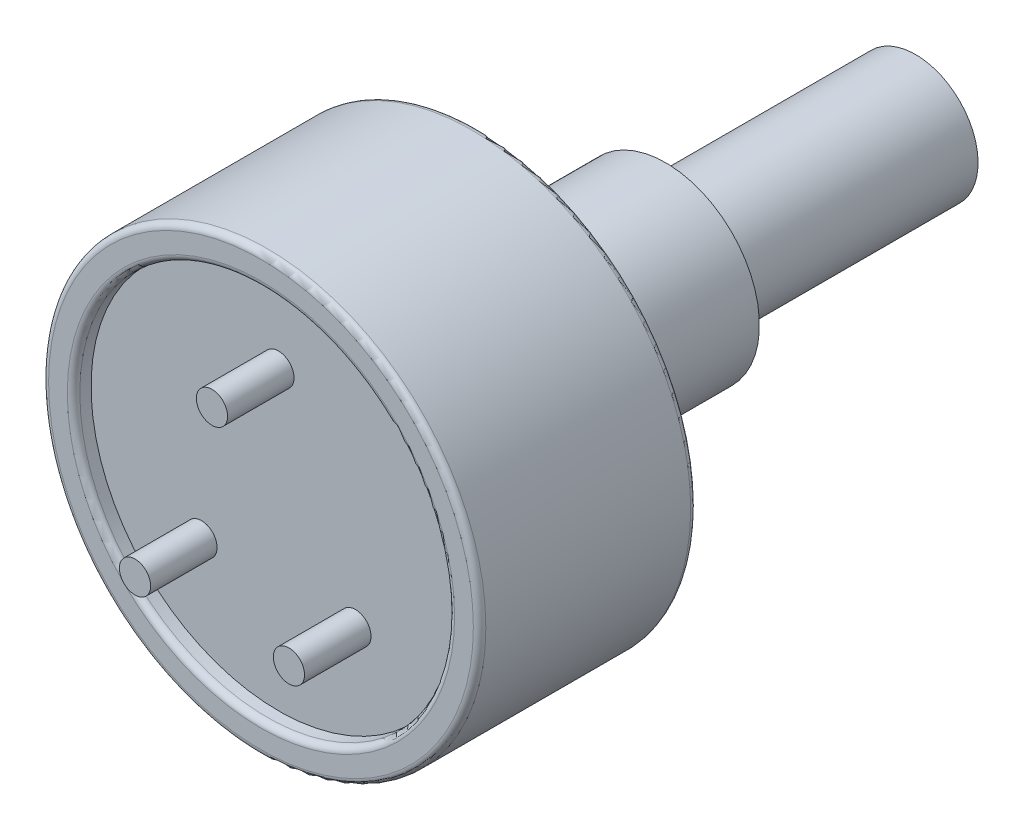
ISO-10303-21;
HEADER;
FILE_DESCRIPTION(('STEP AP214'),'2;1');
FILE_NAME('part.step','',(''),(''),'','','');
FILE_SCHEMA(('AUTOMOTIVE_DESIGN { 1 0 10303 214 1 1 1 1 }'));
ENDSEC;
DATA;
#1=APPLICATION_CONTEXT('core data for automotive mechanical design processes');
#2=APPLICATION_PROTOCOL_DEFINITION('international standard','automotive_design',2000,#1);
#3=PRODUCT_CONTEXT('',#1,'mechanical');
#4=PRODUCT('Part','Part','',(#3));
#5=PRODUCT_RELATED_PRODUCT_CATEGORY('part','',(#4));
#6=PRODUCT_DEFINITION_FORMATION('','',#4);
#7=PRODUCT_DEFINITION_CONTEXT('part definition',#1,'design');
#8=PRODUCT_DEFINITION('design','',#6,#7);
#9=PRODUCT_DEFINITION_SHAPE('','',#8);
#10=(LENGTH_UNIT() NAMED_UNIT(*) SI_UNIT(.MILLI.,.METRE.));
#11=(NAMED_UNIT(*) PLANE_ANGLE_UNIT() SI_UNIT($,.RADIAN.));
#12=(NAMED_UNIT(*) SI_UNIT($,.STERADIAN.) SOLID_ANGLE_UNIT());
#13=UNCERTAINTY_MEASURE_WITH_UNIT(LENGTH_MEASURE(1.E-05),#10,'distance_accuracy_value','');
#14=(GEOMETRIC_REPRESENTATION_CONTEXT(3) GLOBAL_UNCERTAINTY_ASSIGNED_CONTEXT((#13)) GLOBAL_UNIT_ASSIGNED_CONTEXT((#10,
#11,#12)) REPRESENTATION_CONTEXT('',''));
#15=CARTESIAN_POINT('',(0.,0.,0.));
#16=DIRECTION('',(0.,0.,1.));
#17=DIRECTION('',(1.,0.,0.));
#18=AXIS2_PLACEMENT_3D('',#15,#16,#17);
#19=CARTESIAN_POINT('',(0.,0.0193468685916,-22.225));
#20=DIRECTION('',(0.,0.,1.));
#21=DIRECTION('',(1.,0.,0.));
#22=AXIS2_PLACEMENT_3D('',#19,#20,#21);
#23=PLANE('',#22);
#24=CARTESIAN_POINT('',(0.,0.,-22.2249999996));
#25=DIRECTION('',(0.,0.,-1.));
#26=DIRECTION('',(-1.,0.,0.));
#27=AXIS2_PLACEMENT_3D('',#24,#25,#26);
#28=CIRCLE('',#27,3.175);
#29=CARTESIAN_POINT('',(2.17670738501993,-2.3114,-22.2249999996));
#30=VERTEX_POINT('',#29);
#31=CARTESIAN_POINT('',(-2.17670738506493,-2.3114,-22.2249999996));
#32=VERTEX_POINT('',#31);
#33=EDGE_CURVE('E63',#30,#32,#28,.F.);
#34=ORIENTED_EDGE('',*,*,#33,.F.);
#35=DIRECTION('',(1.,0.,0.));
#36=VECTOR('',#35,1.);
#37=CARTESIAN_POINT('',(2.17670738502,-2.3114,-22.2249999996));
#38=LINE('',#37,#36);
#39=EDGE_CURVE('E75',#32,#30,#38,.T.);
#40=ORIENTED_EDGE('',*,*,#39,.F.);
#41=EDGE_LOOP('',(#34,#40));
#42=FACE_BOUND('',#41,.T.);
#43=ADVANCED_FACE('F17',(#42),#23,.F.);
#44=CARTESIAN_POINT('',(-3.9116,-3.90121592455,13.5382));
#45=DIRECTION('',(0.,0.,1.));
#46=DIRECTION('',(1.,0.,0.));
#47=AXIS2_PLACEMENT_3D('',#44,#45,#46);
#48=PLANE('',#47);
#49=CARTESIAN_POINT('',(-3.9116,-3.90121592455,13.5382000003));
#50=DIRECTION('',(0.,0.,1.));
#51=DIRECTION('',(1.,0.,0.));
#52=AXIS2_PLACEMENT_3D('',#49,#50,#51);
#53=CIRCLE('',#52,0.79375);
#54=CARTESIAN_POINT('',(-3.11785,-3.90121592455,13.5382000003));
#55=VERTEX_POINT('',#54);
#56=EDGE_CURVE('E126',#55,#55,#53,.F.);
#57=ORIENTED_EDGE('',*,*,#56,.F.);
#58=EDGE_LOOP('',(#57));
#59=FACE_BOUND('',#58,.T.);
#60=ADVANCED_FACE('F436',(#59),#48,.T.);
#61=CARTESIAN_POINT('',(3.9116,-3.90121592455,13.5382));
#62=DIRECTION('',(0.,0.,1.));
#63=DIRECTION('',(1.,0.,0.));
#64=AXIS2_PLACEMENT_3D('',#61,#62,#63);
#65=PLANE('',#64);
#66=CARTESIAN_POINT('',(3.9116,-3.90121592455,13.5382000003));
#67=DIRECTION('',(0.,0.,1.));
#68=DIRECTION('',(1.,0.,0.));
#69=AXIS2_PLACEMENT_3D('',#66,#67,#68);
#70=CIRCLE('',#69,0.79375);
#71=CARTESIAN_POINT('',(4.70535,-3.90121592455,13.5382000003));
#72=VERTEX_POINT('',#71);
#73=EDGE_CURVE('E123',#72,#72,#70,.F.);
#74=ORIENTED_EDGE('',*,*,#73,.F.);
#75=EDGE_LOOP('',(#74));
#76=FACE_BOUND('',#75,.T.);
#77=ADVANCED_FACE('F426',(#76),#65,.T.);
#78=CARTESIAN_POINT('',(0.,5.5245,13.5382));
#79=DIRECTION('',(0.,0.,1.));
#80=DIRECTION('',(1.,0.,0.));
#81=AXIS2_PLACEMENT_3D('',#78,#79,#80);
#82=PLANE('',#81);
#83=CARTESIAN_POINT('',(0.,5.5245,13.5382000003));
#84=DIRECTION('',(0.,0.,1.));
#85=DIRECTION('',(1.,0.,0.));
#86=AXIS2_PLACEMENT_3D('',#83,#84,#85);
#87=CIRCLE('',#86,0.79375);
#88=CARTESIAN_POINT('',(0.79375,5.5245,13.5382000003));
#89=VERTEX_POINT('',#88);
#90=EDGE_CURVE('E120',#89,#89,#87,.F.);
#91=ORIENTED_EDGE('',*,*,#90,.F.);
#92=EDGE_LOOP('',(#91));
#93=FACE_BOUND('',#92,.T.);
#94=ADVANCED_FACE('F417',(#93),#82,.T.);
#95=CARTESIAN_POINT('',(0.,0.,0.));
#96=DIRECTION('',(0.,0.,-1.));
#97=DIRECTION('',(-1.,0.,0.));
#98=AXIS2_PLACEMENT_3D('',#95,#96,#97);
#99=CYLINDRICAL_SURFACE('',#98,3.175);
#100=DIRECTION('',(0.,0.,-1.));
#101=VECTOR('',#100,1.);
#102=CARTESIAN_POINT('',(2.17670738502,-2.3114,0.));
#103=LINE('',#102,#101);
#104=CARTESIAN_POINT('',(2.17670738501462,-2.3114000000075,-9.525000000185));
#105=VERTEX_POINT('',#104);
#106=EDGE_CURVE('E72',#30,#105,#103,.F.);
#107=ORIENTED_EDGE('',*,*,#106,.F.);
#108=ORIENTED_EDGE('',*,*,#33,.T.);
#109=DIRECTION('',(0.,0.,-1.));
#110=VECTOR('',#109,1.);
#111=CARTESIAN_POINT('',(-2.17670738511,-2.3114,0.));
#112=LINE('',#111,#110);
#113=CARTESIAN_POINT('',(-2.17670738505962,-2.311400000005,-9.525));
#114=VERTEX_POINT('',#113);
#115=EDGE_CURVE('E69',#114,#32,#112,.T.);
#116=ORIENTED_EDGE('',*,*,#115,.F.);
#117=CARTESIAN_POINT('',(0.,0.,-9.52500000037));
#118=DIRECTION('',(0.,0.,-1.));
#119=DIRECTION('',(-1.,0.,0.));
#120=AXIS2_PLACEMENT_3D('',#117,#118,#119);
#121=CIRCLE('',#120,3.175);
#122=EDGE_CURVE('E118',#114,#105,#121,.T.);
#123=ORIENTED_EDGE('',*,*,#122,.T.);
#124=EDGE_LOOP('',(#107,#108,#116,#123));
#125=FACE_BOUND('',#124,.T.);
#126=ADVANCED_FACE('F67',(#125),#99,.T.);
#127=CARTESIAN_POINT('',(2.17670738502,-2.3114,0.));
#128=DIRECTION('',(0.,-1.,0.));
#129=DIRECTION('',(0.,0.,-1.));
#130=AXIS2_PLACEMENT_3D('',#127,#128,#129);
#131=PLANE('',#130);
#132=ORIENTED_EDGE('',*,*,#39,.T.);
#133=ORIENTED_EDGE('',*,*,#106,.T.);
#134=DIRECTION('',(1.,0.,0.));
#135=VECTOR('',#134,1.);
#136=CARTESIAN_POINT('',(0.,-2.31140000001,-9.525));
#137=LINE('',#136,#135);
#138=EDGE_CURVE('E80',#105,#114,#137,.F.);
#139=ORIENTED_EDGE('',*,*,#138,.T.);
#140=ORIENTED_EDGE('',*,*,#115,.T.);
#141=EDGE_LOOP('',(#132,#133,#139,#140));
#142=FACE_BOUND('',#141,.T.);
#143=ADVANCED_FACE('F78',(#142),#131,.T.);
#144=CARTESIAN_POINT('',(-3.9116,-3.90121592455,0.));
#145=DIRECTION('',(0.,0.,1.));
#146=DIRECTION('',(1.,0.,0.));
#147=AXIS2_PLACEMENT_3D('',#144,#145,#146);
#148=CYLINDRICAL_SURFACE('',#147,0.79375);
#149=CARTESIAN_POINT('',(-3.9116,-3.90121592455,10.1600000001));
#150=DIRECTION('',(0.,0.,1.));
#151=DIRECTION('',(1.,0.,0.));
#152=AXIS2_PLACEMENT_3D('',#149,#150,#151);
#153=CIRCLE('',#152,0.79375);
#154=CARTESIAN_POINT('',(-3.11785,-3.90121592455,10.1600000001));
#155=VERTEX_POINT('',#154);
#156=EDGE_CURVE('E115',#155,#155,#153,.F.);
#157=ORIENTED_EDGE('',*,*,#156,.F.);
#158=EDGE_LOOP('',(#157));
#159=FACE_BOUND('',#158,.T.);
#160=ORIENTED_EDGE('',*,*,#56,.T.);
#161=EDGE_LOOP('',(#160));
#162=FACE_BOUND('',#161,.T.);
#163=ADVANCED_FACE('F390',(#159,#162),#148,.T.);
#164=CARTESIAN_POINT('',(3.9116,-3.90121592455,0.));
#165=DIRECTION('',(0.,0.,1.));
#166=DIRECTION('',(1.,0.,0.));
#167=AXIS2_PLACEMENT_3D('',#164,#165,#166);
#168=CYLINDRICAL_SURFACE('',#167,0.79375);
#169=CARTESIAN_POINT('',(3.9116,-3.90121592455,10.1600000001));
#170=DIRECTION('',(0.,0.,1.));
#171=DIRECTION('',(1.,0.,0.));
#172=AXIS2_PLACEMENT_3D('',#169,#170,#171);
#173=CIRCLE('',#172,0.79375);
#174=CARTESIAN_POINT('',(4.70535,-3.90121592455,10.1600000001));
#175=VERTEX_POINT('',#174);
#176=EDGE_CURVE('E112',#175,#175,#173,.F.);
#177=ORIENTED_EDGE('',*,*,#176,.F.);
#178=EDGE_LOOP('',(#177));
#179=FACE_BOUND('',#178,.T.);
#180=ORIENTED_EDGE('',*,*,#73,.T.);
#181=EDGE_LOOP('',(#180));
#182=FACE_BOUND('',#181,.T.);
#183=ADVANCED_FACE('F380',(#179,#182),#168,.T.);
#184=CARTESIAN_POINT('',(0.,5.5245,0.));
#185=DIRECTION('',(0.,0.,1.));
#186=DIRECTION('',(1.,0.,0.));
#187=AXIS2_PLACEMENT_3D('',#184,#185,#186);
#188=CYLINDRICAL_SURFACE('',#187,0.79375);
#189=CARTESIAN_POINT('',(0.,5.5245,10.1600000001));
#190=DIRECTION('',(0.,0.,1.));
#191=DIRECTION('',(1.,0.,0.));
#192=AXIS2_PLACEMENT_3D('',#189,#190,#191);
#193=CIRCLE('',#192,0.79375);
#194=CARTESIAN_POINT('',(0.79375,5.5245,10.1600000001));
#195=VERTEX_POINT('',#194);
#196=EDGE_CURVE('E109',#195,#195,#193,.F.);
#197=ORIENTED_EDGE('',*,*,#196,.F.);
#198=EDGE_LOOP('',(#197));
#199=FACE_BOUND('',#198,.T.);
#200=ORIENTED_EDGE('',*,*,#90,.T.);
#201=EDGE_LOOP('',(#200));
#202=FACE_BOUND('',#201,.T.);
#203=ADVANCED_FACE('F289',(#199,#202),#188,.T.);
#204=CARTESIAN_POINT('',(0.,0.,-9.525));
#205=DIRECTION('',(0.,0.,1.));
#206=DIRECTION('',(1.,0.,0.));
#207=AXIS2_PLACEMENT_3D('',#204,#205,#206);
#208=PLANE('',#207);
#209=ORIENTED_EDGE('',*,*,#122,.F.);
#210=ORIENTED_EDGE('',*,*,#138,.F.);
#211=EDGE_LOOP('',(#209,#210));
#212=FACE_BOUND('',#211,.T.);
#213=CARTESIAN_POINT('',(0.,0.,-9.52500000037));
#214=DIRECTION('',(0.,0.,-1.));
#215=DIRECTION('',(-1.,0.,0.));
#216=AXIS2_PLACEMENT_3D('',#213,#214,#215);
#217=CIRCLE('',#216,4.7625);
#218=CARTESIAN_POINT('',(-4.7625,0.,-9.52500000037));
#219=VERTEX_POINT('',#218);
#220=EDGE_CURVE('E106',#219,#219,#217,.F.);
#221=ORIENTED_EDGE('',*,*,#220,.F.);
#222=EDGE_LOOP('',(#221));
#223=FACE_BOUND('',#222,.T.);
#224=ADVANCED_FACE('F279',(#212,#223),#208,.F.);
#225=CARTESIAN_POINT('',(0.,0.,10.16));
#226=DIRECTION('',(0.,0.,1.));
#227=DIRECTION('',(1.,0.,0.));
#228=AXIS2_PLACEMENT_3D('',#225,#226,#227);
#229=PLANE('',#228);
#230=ORIENTED_EDGE('',*,*,#196,.T.);
#231=EDGE_LOOP('',(#230));
#232=FACE_BOUND('',#231,.T.);
#233=ORIENTED_EDGE('',*,*,#176,.T.);
#234=EDGE_LOOP('',(#233));
#235=FACE_BOUND('',#234,.T.);
#236=ORIENTED_EDGE('',*,*,#156,.T.);
#237=EDGE_LOOP('',(#236));
#238=FACE_BOUND('',#237,.T.);
#239=CARTESIAN_POINT('',(0.,0.,10.1600000001));
#240=DIRECTION('',(0.,0.,1.));
#241=DIRECTION('',(1.,0.,0.));
#242=AXIS2_PLACEMENT_3D('',#239,#240,#241);
#243=CIRCLE('',#242,9.525);
#244=CARTESIAN_POINT('',(9.525,0.,10.1600000001));
#245=VERTEX_POINT('',#244);
#246=EDGE_CURVE('E103',#245,#245,#243,.T.);
#247=ORIENTED_EDGE('',*,*,#246,.T.);
#248=EDGE_LOOP('',(#247));
#249=FACE_BOUND('',#248,.T.);
#250=ADVANCED_FACE('F277',(#232,#235,#238,#249),#229,.T.);
#251=CARTESIAN_POINT('',(0.,0.,0.));
#252=DIRECTION('',(0.,0.,-1.));
#253=DIRECTION('',(-1.,0.,0.));
#254=AXIS2_PLACEMENT_3D('',#251,#252,#253);
#255=CYLINDRICAL_SURFACE('',#254,4.7625);
#256=ORIENTED_EDGE('',*,*,#220,.T.);
#257=EDGE_LOOP('',(#256));
#258=FACE_BOUND('',#257,.T.);
#259=CARTESIAN_POINT('',(0.,0.,-1.49860000052));
#260=DIRECTION('',(0.,0.,-1.));
#261=DIRECTION('',(-1.,0.,0.));
#262=AXIS2_PLACEMENT_3D('',#259,#260,#261);
#263=CIRCLE('',#262,4.7625);
#264=CARTESIAN_POINT('',(-4.7625,0.,-1.49860000052));
#265=VERTEX_POINT('',#264);
#266=EDGE_CURVE('E100',#265,#265,#263,.T.);
#267=ORIENTED_EDGE('',*,*,#266,.T.);
#268=EDGE_LOOP('',(#267));
#269=FACE_BOUND('',#268,.T.);
#270=ADVANCED_FACE('F273',(#258,#269),#255,.T.);
#271=CARTESIAN_POINT('',(0.,0.,0.));
#272=DIRECTION('',(0.,0.,1.));
#273=DIRECTION('',(1.,0.,0.));
#274=AXIS2_PLACEMENT_3D('',#271,#272,#273);
#275=CYLINDRICAL_SURFACE('',#274,9.525);
#276=CARTESIAN_POINT('',(0.,0.,10.7315));
#277=DIRECTION('',(0.,0.,-1.));
#278=DIRECTION('',(-1.,0.,0.));
#279=AXIS2_PLACEMENT_3D('',#276,#277,#278);
#280=CIRCLE('',#279,9.525);
#281=CARTESIAN_POINT('',(-9.525,0.,10.7315));
#282=VERTEX_POINT('',#281);
#283=EDGE_CURVE('E99',#282,#282,#280,.T.);
#284=ORIENTED_EDGE('',*,*,#283,.F.);
#285=EDGE_LOOP('',(#284));
#286=FACE_BOUND('',#285,.T.);
#287=ORIENTED_EDGE('',*,*,#246,.F.);
#288=EDGE_LOOP('',(#287));
#289=FACE_BOUND('',#288,.T.);
#290=ADVANCED_FACE('F269',(#286,#289),#275,.F.);
#291=CARTESIAN_POINT('',(0.,7.366,-1.4986));
#292=DIRECTION('',(0.,0.,1.));
#293=DIRECTION('',(1.,0.,0.));
#294=AXIS2_PLACEMENT_3D('',#291,#292,#293);
#295=PLANE('',#294);
#296=CARTESIAN_POINT('',(0.,7.366,-1.4986));
#297=DIRECTION('',(0.,0.,-1.));
#298=DIRECTION('',(-1.,0.,0.));
#299=AXIS2_PLACEMENT_3D('',#296,#297,#298);
#300=CIRCLE('',#299,0.79375);
#301=CARTESIAN_POINT('',(-0.79375,7.366,-1.4986));
#302=VERTEX_POINT('',#301);
#303=EDGE_CURVE('E96',#302,#302,#300,.F.);
#304=ORIENTED_EDGE('',*,*,#303,.F.);
#305=EDGE_LOOP('',(#304));
#306=FACE_BOUND('',#305,.T.);
#307=ADVANCED_FACE('F272',(#306),#295,.F.);
#308=CARTESIAN_POINT('',(0.,0.,-1.4986));
#309=DIRECTION('',(0.,0.,1.));
#310=DIRECTION('',(1.,0.,0.));
#311=AXIS2_PLACEMENT_3D('',#308,#309,#310);
#312=PLANE('',#311);
#313=ORIENTED_EDGE('',*,*,#266,.F.);
#314=EDGE_LOOP('',(#313));
#315=FACE_BOUND('',#314,.T.);
#316=CARTESIAN_POINT('',(0.,0.,-1.49860000052));
#317=DIRECTION('',(0.,0.,-1.));
#318=DIRECTION('',(-1.,0.,0.));
#319=AXIS2_PLACEMENT_3D('',#316,#317,#318);
#320=CIRCLE('',#319,5.1562);
#321=CARTESIAN_POINT('',(-5.1562,0.,-1.49860000052));
#322=VERTEX_POINT('',#321);
#323=EDGE_CURVE('E92',#322,#322,#320,.F.);
#324=ORIENTED_EDGE('',*,*,#323,.F.);
#325=EDGE_LOOP('',(#324));
#326=FACE_BOUND('',#325,.T.);
#327=ADVANCED_FACE('F253',(#315,#326),#312,.F.);
#328=CARTESIAN_POINT('',(0.,0.,10.7315));
#329=DIRECTION('',(0.,0.,-1.));
#330=DIRECTION('',(-1.,0.,0.));
#331=AXIS2_PLACEMENT_3D('',#328,#329,#330);
#332=TOROIDAL_SURFACE('',#331,9.8425,0.3175);
#333=CARTESIAN_POINT('',(0.,0.,11.049));
#334=DIRECTION('',(0.,0.,1.));
#335=DIRECTION('',(-1.,0.,0.));
#336=AXIS2_PLACEMENT_3D('',#333,#334,#335);
#337=CIRCLE('',#336,9.84249999933);
#338=CARTESIAN_POINT('',(9.842499999531,0.,11.049));
#339=VERTEX_POINT('',#338);
#340=CARTESIAN_POINT('',(-9.842499999531,0.,11.049));
#341=VERTEX_POINT('',#340);
#342=EDGE_CURVE('E95',#339,#341,#337,.F.);
#343=ORIENTED_EDGE('',*,*,#342,.F.);
#344=CARTESIAN_POINT('',(0.,0.,11.049));
#345=DIRECTION('',(0.,0.,1.));
#346=DIRECTION('',(1.,0.,0.));
#347=AXIS2_PLACEMENT_3D('',#344,#345,#346);
#348=CIRCLE('',#347,9.842499999665);
#349=EDGE_CURVE('E228',#341,#339,#348,.F.);
#350=ORIENTED_EDGE('',*,*,#349,.F.);
#351=EDGE_LOOP('',(#343,#350));
#352=FACE_BOUND('',#351,.T.);
#353=ORIENTED_EDGE('',*,*,#283,.T.);
#354=EDGE_LOOP('',(#353));
#355=FACE_BOUND('',#354,.T.);
#356=ADVANCED_FACE('F248',(#352,#355),#332,.T.);
#357=CARTESIAN_POINT('',(0.,7.366,0.));
#358=DIRECTION('',(0.,0.,-1.));
#359=DIRECTION('',(-1.,0.,0.));
#360=AXIS2_PLACEMENT_3D('',#357,#358,#359);
#361=CYLINDRICAL_SURFACE('',#360,0.79375);
#362=ORIENTED_EDGE('',*,*,#303,.T.);
#363=EDGE_LOOP('',(#362));
#364=FACE_BOUND('',#363,.T.);
#365=CARTESIAN_POINT('',(0.,7.366,0.));
#366=DIRECTION('',(0.,0.,-1.));
#367=DIRECTION('',(-1.,0.,0.));
#368=AXIS2_PLACEMENT_3D('',#365,#366,#367);
#369=CIRCLE('',#368,0.79375);
#370=CARTESIAN_POINT('',(-0.79375,7.366,0.));
#371=VERTEX_POINT('',#370);
#372=EDGE_CURVE('E89',#371,#371,#369,.T.);
#373=ORIENTED_EDGE('',*,*,#372,.T.);
#374=EDGE_LOOP('',(#373));
#375=FACE_BOUND('',#374,.T.);
#376=ADVANCED_FACE('F252',(#364,#375),#361,.T.);
#377=CARTESIAN_POINT('',(0.,0.,0.));
#378=DIRECTION('',(0.,0.,-1.));
#379=DIRECTION('',(-1.,0.,0.));
#380=AXIS2_PLACEMENT_3D('',#377,#378,#379);
#381=CYLINDRICAL_SURFACE('',#380,5.1562);
#382=CARTESIAN_POINT('',(0.,0.,0.));
#383=DIRECTION('',(0.,0.,-1.));
#384=DIRECTION('',(-1.,0.,0.));
#385=AXIS2_PLACEMENT_3D('',#382,#383,#384);
#386=CIRCLE('',#385,5.1562);
#387=CARTESIAN_POINT('',(-5.1562,0.,0.));
#388=VERTEX_POINT('',#387);
#389=EDGE_CURVE('E85',#388,#388,#386,.T.);
#390=ORIENTED_EDGE('',*,*,#389,.T.);
#391=EDGE_LOOP('',(#390));
#392=FACE_BOUND('',#391,.T.);
#393=ORIENTED_EDGE('',*,*,#323,.T.);
#394=EDGE_LOOP('',(#393));
#395=FACE_BOUND('',#394,.T.);
#396=ADVANCED_FACE('F207',(#392,#395),#381,.T.);
#397=CARTESIAN_POINT('',(0.,0.,11.049));
#398=DIRECTION('',(0.,0.,1.));
#399=DIRECTION('',(1.,0.,0.));
#400=AXIS2_PLACEMENT_3D('',#397,#398,#399);
#401=PLANE('',#400);
#402=ORIENTED_EDGE('',*,*,#342,.T.);
#403=ORIENTED_EDGE('',*,*,#349,.T.);
#404=EDGE_LOOP('',(#402,#403));
#405=FACE_BOUND('',#404,.T.);
#406=CARTESIAN_POINT('',(0.,0.,11.049));
#407=DIRECTION('',(0.,0.,-1.));
#408=DIRECTION('',(-1.,0.,0.));
#409=AXIS2_PLACEMENT_3D('',#406,#407,#408);
#410=CIRCLE('',#409,10.795);
#411=CARTESIAN_POINT('',(-10.795,0.,11.049));
#412=VERTEX_POINT('',#411);
#413=CARTESIAN_POINT('',(10.795,0.,11.049));
#414=VERTEX_POINT('',#413);
#415=EDGE_CURVE('E132',#412,#414,#410,.T.);
#416=ORIENTED_EDGE('',*,*,#415,.F.);
#417=CARTESIAN_POINT('',(0.,0.,11.049));
#418=DIRECTION('',(0.,0.,-1.));
#419=DIRECTION('',(1.,0.,0.));
#420=AXIS2_PLACEMENT_3D('',#417,#418,#419);
#421=CIRCLE('',#420,10.795);
#422=EDGE_CURVE('E88',#414,#412,#421,.T.);
#423=ORIENTED_EDGE('',*,*,#422,.F.);
#424=EDGE_LOOP('',(#416,#423));
#425=FACE_BOUND('',#424,.T.);
#426=ADVANCED_FACE('F198',(#405,#425),#401,.T.);
#427=CARTESIAN_POINT('',(0.,0.,0.));
#428=DIRECTION('',(0.,0.,1.));
#429=DIRECTION('',(1.,0.,0.));
#430=AXIS2_PLACEMENT_3D('',#427,#428,#429);
#431=PLANE('',#430);
#432=ORIENTED_EDGE('',*,*,#389,.F.);
#433=EDGE_LOOP('',(#432));
#434=FACE_BOUND('',#433,.T.);
#435=ORIENTED_EDGE('',*,*,#372,.F.);
#436=EDGE_LOOP('',(#435));
#437=FACE_BOUND('',#436,.T.);
#438=CARTESIAN_POINT('',(0.,0.,0.));
#439=DIRECTION('',(0.,0.,1.));
#440=DIRECTION('',(1.,0.,0.));
#441=AXIS2_PLACEMENT_3D('',#438,#439,#440);
#442=CIRCLE('',#441,10.795);
#443=CARTESIAN_POINT('',(10.795,0.,0.));
#444=VERTEX_POINT('',#443);
#445=CARTESIAN_POINT('',(-10.795,0.,0.));
#446=VERTEX_POINT('',#445);
#447=EDGE_CURVE('E36',#444,#446,#442,.T.);
#448=ORIENTED_EDGE('',*,*,#447,.F.);
#449=CARTESIAN_POINT('',(0.,0.,0.));
#450=DIRECTION('',(0.,0.,1.));
#451=DIRECTION('',(-1.,0.,0.));
#452=AXIS2_PLACEMENT_3D('',#449,#450,#451);
#453=CIRCLE('',#452,10.795);
#454=EDGE_CURVE('E171',#446,#444,#453,.T.);
#455=ORIENTED_EDGE('',*,*,#454,.F.);
#456=EDGE_LOOP('',(#448,#455));
#457=FACE_BOUND('',#456,.T.);
#458=ADVANCED_FACE('F151',(#434,#437,#457),#431,.F.);
#459=CARTESIAN_POINT('',(0.,0.,10.7315));
#460=DIRECTION('',(0.,0.,1.));
#461=DIRECTION('',(-1.,0.,0.));
#462=AXIS2_PLACEMENT_3D('',#459,#460,#461);
#463=TOROIDAL_SURFACE('',#462,10.795,0.3175);
#464=ORIENTED_EDGE('',*,*,#415,.T.);
#465=ORIENTED_EDGE('',*,*,#422,.T.);
#466=EDGE_LOOP('',(#464,#465));
#467=FACE_BOUND('',#466,.T.);
#468=CARTESIAN_POINT('',(0.,0.,10.7315));
#469=DIRECTION('',(0.,0.,1.));
#470=DIRECTION('',(1.,0.,0.));
#471=AXIS2_PLACEMENT_3D('',#468,#469,#470);
#472=CIRCLE('',#471,11.1125);
#473=CARTESIAN_POINT('',(11.1125,0.,10.7315));
#474=VERTEX_POINT('',#473);
#475=EDGE_CURVE('E28',#474,#474,#472,.F.);
#476=ORIENTED_EDGE('',*,*,#475,.F.);
#477=EDGE_LOOP('',(#476));
#478=FACE_BOUND('',#477,.T.);
#479=ADVANCED_FACE('F139',(#467,#478),#463,.T.);
#480=CARTESIAN_POINT('',(0.,0.,0.3175));
#481=DIRECTION('',(0.,0.,-1.));
#482=DIRECTION('',(1.,0.,0.));
#483=AXIS2_PLACEMENT_3D('',#480,#481,#482);
#484=TOROIDAL_SURFACE('',#483,10.795,0.3175);
#485=ORIENTED_EDGE('',*,*,#454,.T.);
#486=ORIENTED_EDGE('',*,*,#447,.T.);
#487=EDGE_LOOP('',(#485,#486));
#488=FACE_BOUND('',#487,.T.);
#489=CARTESIAN_POINT('',(0.,0.,0.31750000082));
#490=DIRECTION('',(0.,0.,1.));
#491=DIRECTION('',(1.,0.,0.));
#492=AXIS2_PLACEMENT_3D('',#489,#490,#491);
#493=CIRCLE('',#492,11.1125);
#494=CARTESIAN_POINT('',(11.1125,0.,0.31750000082));
#495=VERTEX_POINT('',#494);
#496=EDGE_CURVE('E11',#495,#495,#493,.T.);
#497=ORIENTED_EDGE('',*,*,#496,.F.);
#498=EDGE_LOOP('',(#497));
#499=FACE_BOUND('',#498,.T.);
#500=ADVANCED_FACE('F150',(#488,#499),#484,.T.);
#501=CARTESIAN_POINT('',(0.,0.,0.));
#502=DIRECTION('',(0.,0.,1.));
#503=DIRECTION('',(1.,0.,0.));
#504=AXIS2_PLACEMENT_3D('',#501,#502,#503);
#505=CYLINDRICAL_SURFACE('',#504,11.1125);
#506=ORIENTED_EDGE('',*,*,#475,.T.);
#507=EDGE_LOOP('',(#506));
#508=FACE_BOUND('',#507,.T.);
#509=ORIENTED_EDGE('',*,*,#496,.T.);
#510=EDGE_LOOP('',(#509));
#511=FACE_BOUND('',#510,.T.);
#512=ADVANCED_FACE('F293',(#508,#511),#505,.T.);
#513=CLOSED_SHELL('',(#43,#60,#77,#94,#126,#143,#163,#183,#203,#224,#250,#270,#290,#307,#327,
#356,#376,#396,#426,#458,#479,#500,#512));
#514=MANIFOLD_SOLID_BREP('B1',#513);
#515=ADVANCED_BREP_SHAPE_REPRESENTATION('',(#18,#514),#14);
#516=SHAPE_DEFINITION_REPRESENTATION(#9,#515);
ENDSEC;
END-ISO-10303-21;
